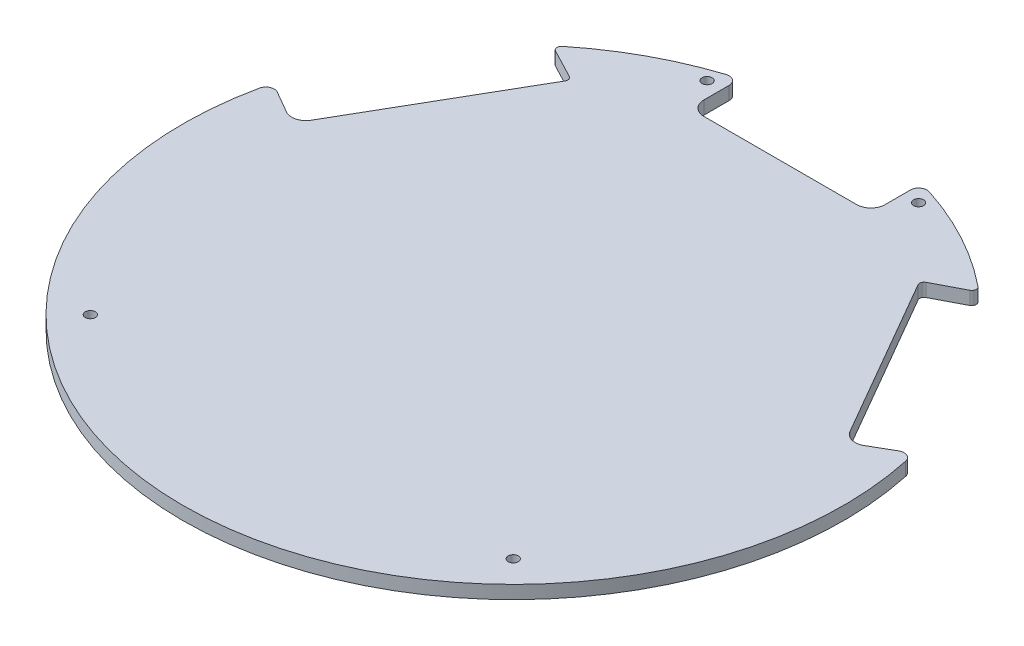
ISO-10303-21;
HEADER;
FILE_DESCRIPTION(('STEP AP214'),'2;1');
FILE_NAME('part.step','',(''),(''),'','','');
FILE_SCHEMA(('AUTOMOTIVE_DESIGN { 1 0 10303 214 1 1 1 1 }'));
ENDSEC;
DATA;
#1=APPLICATION_CONTEXT('core data for automotive mechanical design processes');
#2=APPLICATION_PROTOCOL_DEFINITION('international standard','automotive_design',2000,#1);
#3=PRODUCT_CONTEXT('',#1,'mechanical');
#4=PRODUCT('Part','Part','',(#3));
#5=PRODUCT_RELATED_PRODUCT_CATEGORY('part','',(#4));
#6=PRODUCT_DEFINITION_FORMATION('','',#4);
#7=PRODUCT_DEFINITION_CONTEXT('part definition',#1,'design');
#8=PRODUCT_DEFINITION('design','',#6,#7);
#9=PRODUCT_DEFINITION_SHAPE('','',#8);
#10=(LENGTH_UNIT() NAMED_UNIT(*) SI_UNIT(.MILLI.,.METRE.));
#11=(NAMED_UNIT(*) PLANE_ANGLE_UNIT() SI_UNIT($,.RADIAN.));
#12=(NAMED_UNIT(*) SI_UNIT($,.STERADIAN.) SOLID_ANGLE_UNIT());
#13=UNCERTAINTY_MEASURE_WITH_UNIT(LENGTH_MEASURE(1.E-05),#10,'distance_accuracy_value','');
#14=(GEOMETRIC_REPRESENTATION_CONTEXT(3) GLOBAL_UNCERTAINTY_ASSIGNED_CONTEXT((#13)) GLOBAL_UNIT_ASSIGNED_CONTEXT((#10,
#11,#12)) REPRESENTATION_CONTEXT('',''));
#15=CARTESIAN_POINT('',(0.,0.,0.));
#16=DIRECTION('',(0.,0.,1.));
#17=DIRECTION('',(1.,0.,0.));
#18=AXIS2_PLACEMENT_3D('',#15,#16,#17);
#19=CARTESIAN_POINT('',(-10.2861425547404,3.,17.8161215187071));
#20=DIRECTION('',(-0.499999999999991,0.,0.866025403784444));
#21=DIRECTION('',(0.866025403784444,0.,0.499999999999991));
#22=AXIS2_PLACEMENT_3D('',#19,#20,#21);
#23=PLANE('',#22);
#24=DIRECTION('',(-0.866025403784444,0.,-0.499999999999991));
#25=VECTOR('',#24,1.);
#26=CARTESIAN_POINT('',(-10.2861425547404,0.,17.8161215187071));
#27=LINE('',#26,#25);
#28=CARTESIAN_POINT('',(-65.5613562943293,0.,-14.0970380133579));
#29=VERTEX_POINT('',#28);
#30=CARTESIAN_POINT('',(-70.5381646243506,0.,-16.9703996424007));
#31=VERTEX_POINT('',#30);
#32=EDGE_CURVE('E241',#29,#31,#27,.T.);
#33=ORIENTED_EDGE('',*,*,#32,.T.);
#34=DIRECTION('',(0.,-1.,0.));
#35=VECTOR('',#34,1.);
#36=CARTESIAN_POINT('',(-70.5381646243506,3.,-16.9703996424007));
#37=LINE('',#36,#35);
#38=CARTESIAN_POINT('',(-70.5381646243506,3.,-16.9703996424007));
#39=VERTEX_POINT('',#38);
#40=EDGE_CURVE('E11',#39,#31,#37,.T.);
#41=ORIENTED_EDGE('',*,*,#40,.F.);
#42=DIRECTION('',(-0.866025403784444,0.,-0.499999999999991));
#43=VECTOR('',#42,1.);
#44=CARTESIAN_POINT('',(-10.2861425547404,3.,17.8161215187071));
#45=LINE('',#44,#43);
#46=CARTESIAN_POINT('',(-65.5613562943293,3.,-14.0970380133579));
#47=VERTEX_POINT('',#46);
#48=EDGE_CURVE('E371',#47,#39,#45,.T.);
#49=ORIENTED_EDGE('',*,*,#48,.F.);
#50=DIRECTION('',(0.,-1.,0.));
#51=VECTOR('',#50,1.);
#52=CARTESIAN_POINT('',(-65.5613562943293,3.,-14.0970380133579));
#53=LINE('',#52,#51);
#54=EDGE_CURVE('E52',#47,#29,#53,.T.);
#55=ORIENTED_EDGE('',*,*,#54,.T.);
#56=EDGE_LOOP('',(#33,#41,#49,#55));
#57=FACE_BOUND('',#56,.T.);
#58=ADVANCED_FACE('F35',(#57),#23,.F.);
#59=CARTESIAN_POINT('',(-71.4834513960105,3.,-15.3331149261629));
#60=DIRECTION('',(0.,-1.,0.));
#61=DIRECTION('',(0.,0.,-1.));
#62=AXIS2_PLACEMENT_3D('',#59,#60,#61);
#63=CYLINDRICAL_SURFACE('',#62,1.89057354331991);
#64=CARTESIAN_POINT('',(-71.4834513960105,0.,-15.3331149261629));
#65=DIRECTION('',(0.,1.,0.));
#66=DIRECTION('',(0.,0.,1.));
#67=AXIS2_PLACEMENT_3D('',#64,#65,#66);
#68=CIRCLE('',#67,1.89057354331991);
#69=CARTESIAN_POINT('',(-73.3319780299128,0.,-15.7296216807777));
#70=VERTEX_POINT('',#69);
#71=EDGE_CURVE('E243',#31,#70,#68,.T.);
#72=ORIENTED_EDGE('',*,*,#71,.T.);
#73=DIRECTION('',(0.,-1.,0.));
#74=VECTOR('',#73,1.);
#75=CARTESIAN_POINT('',(-73.3319780299128,3.,-15.7296216807777));
#76=LINE('',#75,#74);
#77=CARTESIAN_POINT('',(-73.3319780299128,3.,-15.7296216807777));
#78=VERTEX_POINT('',#77);
#79=EDGE_CURVE('E44',#78,#70,#76,.T.);
#80=ORIENTED_EDGE('',*,*,#79,.F.);
#81=CARTESIAN_POINT('',(-71.4834513960105,3.,-15.3331149261629));
#82=DIRECTION('',(0.,1.,0.));
#83=DIRECTION('',(0.,0.,1.));
#84=AXIS2_PLACEMENT_3D('',#81,#82,#83);
#85=CIRCLE('',#84,1.89057354331991);
#86=EDGE_CURVE('E138',#39,#78,#85,.T.);
#87=ORIENTED_EDGE('',*,*,#86,.F.);
#88=ORIENTED_EDGE('',*,*,#40,.T.);
#89=EDGE_LOOP('',(#72,#80,#87,#88));
#90=FACE_BOUND('',#89,.T.);
#91=ADVANCED_FACE('F354',(#90),#63,.T.);
#92=CARTESIAN_POINT('',(0.,3.,0.));
#93=DIRECTION('',(0.,-1.,0.));
#94=DIRECTION('',(0.,0.,-1.));
#95=AXIS2_PLACEMENT_3D('',#92,#93,#94);
#96=CYLINDRICAL_SURFACE('',#95,75.);
#97=CARTESIAN_POINT('',(0.,0.,0.));
#98=DIRECTION('',(0.,1.,0.));
#99=DIRECTION('',(0.,0.,1.));
#100=AXIS2_PLACEMENT_3D('',#97,#98,#99);
#101=CIRCLE('',#100,75.);
#102=CARTESIAN_POINT('',(73.3319780299128,0.,-15.7296216807778));
#103=VERTEX_POINT('',#102);
#104=EDGE_CURVE('E246',#103,#70,#101,.F.);
#105=ORIENTED_EDGE('',*,*,#104,.F.);
#106=DIRECTION('',(0.,-1.,0.));
#107=VECTOR('',#106,1.);
#108=CARTESIAN_POINT('',(73.3319780299128,3.,-15.7296216807778));
#109=LINE('',#108,#107);
#110=CARTESIAN_POINT('',(73.3319780299128,3.,-15.7296216807778));
#111=VERTEX_POINT('',#110);
#112=EDGE_CURVE('E347',#111,#103,#109,.T.);
#113=ORIENTED_EDGE('',*,*,#112,.F.);
#114=CARTESIAN_POINT('',(0.,3.,0.));
#115=DIRECTION('',(0.,1.,0.));
#116=DIRECTION('',(0.,0.,1.));
#117=AXIS2_PLACEMENT_3D('',#114,#115,#116);
#118=CIRCLE('',#117,75.);
#119=EDGE_CURVE('E353',#111,#78,#118,.F.);
#120=ORIENTED_EDGE('',*,*,#119,.T.);
#121=ORIENTED_EDGE('',*,*,#79,.T.);
#122=EDGE_LOOP('',(#105,#113,#120,#121));
#123=FACE_BOUND('',#122,.T.);
#124=ADVANCED_FACE('F351',(#123),#96,.T.);
#125=CARTESIAN_POINT('',(71.4834513960105,3.,-15.333114926163));
#126=DIRECTION('',(0.,-1.,0.));
#127=DIRECTION('',(0.,0.,-1.));
#128=AXIS2_PLACEMENT_3D('',#125,#126,#127);
#129=CYLINDRICAL_SURFACE('',#128,1.89057354331991);
#130=CARTESIAN_POINT('',(71.4834513960105,0.,-15.333114926163));
#131=DIRECTION('',(0.,1.,0.));
#132=DIRECTION('',(0.,0.,1.));
#133=AXIS2_PLACEMENT_3D('',#130,#131,#132);
#134=CIRCLE('',#133,1.89057354331991);
#135=CARTESIAN_POINT('',(70.5381646243506,0.,-16.9703996424008));
#136=VERTEX_POINT('',#135);
#137=EDGE_CURVE('E249',#136,#103,#134,.F.);
#138=ORIENTED_EDGE('',*,*,#137,.F.);
#139=DIRECTION('',(0.,-1.,0.));
#140=VECTOR('',#139,1.);
#141=CARTESIAN_POINT('',(70.5381646243506,3.,-16.9703996424008));
#142=LINE('',#141,#140);
#143=CARTESIAN_POINT('',(70.5381646243506,3.,-16.9703996424008));
#144=VERTEX_POINT('',#143);
#145=EDGE_CURVE('E345',#144,#136,#142,.T.);
#146=ORIENTED_EDGE('',*,*,#145,.F.);
#147=CARTESIAN_POINT('',(71.4834513960105,3.,-15.333114926163));
#148=DIRECTION('',(0.,1.,0.));
#149=DIRECTION('',(0.,0.,1.));
#150=AXIS2_PLACEMENT_3D('',#147,#148,#149);
#151=CIRCLE('',#150,1.89057354331991);
#152=EDGE_CURVE('E365',#144,#111,#151,.F.);
#153=ORIENTED_EDGE('',*,*,#152,.T.);
#154=ORIENTED_EDGE('',*,*,#112,.T.);
#155=EDGE_LOOP('',(#138,#146,#153,#154));
#156=FACE_BOUND('',#155,.T.);
#157=ADVANCED_FACE('F362',(#156),#129,.T.);
#158=CARTESIAN_POINT('',(10.2861425547403,3.,17.8161215187071));
#159=DIRECTION('',(-0.499999999999991,0.,-0.866025403784444));
#160=DIRECTION('',(-0.866025403784444,0.,0.499999999999991));
#161=AXIS2_PLACEMENT_3D('',#158,#159,#160);
#162=PLANE('',#161);
#163=DIRECTION('',(0.866025403784444,0.,-0.499999999999991));
#164=VECTOR('',#163,1.);
#165=CARTESIAN_POINT('',(10.2861425547403,0.,17.8161215187071));
#166=LINE('',#165,#164);
#167=CARTESIAN_POINT('',(65.5613562943293,0.,-14.0970380133579));
#168=VERTEX_POINT('',#167);
#169=EDGE_CURVE('E252',#168,#136,#166,.T.);
#170=ORIENTED_EDGE('',*,*,#169,.F.);
#171=DIRECTION('',(0.,-1.,0.));
#172=VECTOR('',#171,1.);
#173=CARTESIAN_POINT('',(65.5613562943293,3.,-14.0970380133579));
#174=LINE('',#173,#172);
#175=CARTESIAN_POINT('',(65.5613562943293,3.,-14.0970380133579));
#176=VERTEX_POINT('',#175);
#177=EDGE_CURVE('E343',#176,#168,#174,.T.);
#178=ORIENTED_EDGE('',*,*,#177,.F.);
#179=DIRECTION('',(0.866025403784444,0.,-0.499999999999991));
#180=VECTOR('',#179,1.);
#181=CARTESIAN_POINT('',(10.2861425547403,3.,17.8161215187071));
#182=LINE('',#181,#180);
#183=EDGE_CURVE('E369',#176,#144,#182,.T.);
#184=ORIENTED_EDGE('',*,*,#183,.T.);
#185=ORIENTED_EDGE('',*,*,#145,.T.);
#186=EDGE_LOOP('',(#170,#178,#184,#185));
#187=FACE_BOUND('',#186,.T.);
#188=ADVANCED_FACE('F673',(#187),#162,.T.);
#189=CARTESIAN_POINT('',(63.9517224423217,3.,-16.885005626618));
#190=DIRECTION('',(0.,-1.,0.));
#191=DIRECTION('',(0.,0.,-1.));
#192=AXIS2_PLACEMENT_3D('',#189,#190,#191);
#193=CYLINDRICAL_SURFACE('',#192,3.21926770401525);
#194=CARTESIAN_POINT('',(63.9517224423217,0.,-16.885005626618));
#195=DIRECTION('',(0.,1.,0.));
#196=DIRECTION('',(0.,0.,1.));
#197=AXIS2_PLACEMENT_3D('',#194,#195,#196);
#198=CIRCLE('',#197,3.21926770401525);
#199=CARTESIAN_POINT('',(61.1637548290617,0.,-15.2753717746103));
#200=VERTEX_POINT('',#199);
#201=EDGE_CURVE('E255',#168,#200,#198,.F.);
#202=ORIENTED_EDGE('',*,*,#201,.T.);
#203=DIRECTION('',(0.,-1.,0.));
#204=VECTOR('',#203,1.);
#205=CARTESIAN_POINT('',(61.1637548290617,3.,-15.2753717746103));
#206=LINE('',#205,#204);
#207=CARTESIAN_POINT('',(61.1637548290617,3.,-15.2753717746103));
#208=VERTEX_POINT('',#207);
#209=EDGE_CURVE('E340',#208,#200,#206,.T.);
#210=ORIENTED_EDGE('',*,*,#209,.F.);
#211=CARTESIAN_POINT('',(63.9517224423217,3.,-16.885005626618));
#212=DIRECTION('',(0.,1.,0.));
#213=DIRECTION('',(0.,0.,1.));
#214=AXIS2_PLACEMENT_3D('',#211,#212,#213);
#215=CIRCLE('',#214,3.21926770401525);
#216=EDGE_CURVE('E376',#176,#208,#215,.F.);
#217=ORIENTED_EDGE('',*,*,#216,.F.);
#218=ORIENTED_EDGE('',*,*,#177,.T.);
#219=EDGE_LOOP('',(#202,#210,#217,#218));
#220=FACE_BOUND('',#219,.T.);
#221=ADVANCED_FACE('F663',(#220),#193,.F.);
#222=CARTESIAN_POINT('',(52.4872461263284,3.,-30.3035256800579));
#223=DIRECTION('',(-0.866025403784438,0.,0.5));
#224=DIRECTION('',(0.500000000000001,0.,0.866025403784438));
#225=AXIS2_PLACEMENT_3D('',#222,#223,#224);
#226=PLANE('',#225);
#227=DIRECTION('',(-0.500000000000001,0.,-0.866025403784438));
#228=VECTOR('',#227,1.);
#229=CARTESIAN_POINT('',(52.4872461263284,0.,-30.3035256800579));
#230=LINE('',#229,#228);
#231=CARTESIAN_POINT('',(40.0698204779403,0.,-51.811137802275));
#232=VERTEX_POINT('',#231);
#233=EDGE_CURVE('E257',#200,#232,#230,.T.);
#234=ORIENTED_EDGE('',*,*,#233,.T.);
#235=DIRECTION('',(0.,-1.,0.));
#236=VECTOR('',#235,1.);
#237=CARTESIAN_POINT('',(40.0698204779403,3.,-51.811137802275));
#238=LINE('',#237,#236);
#239=CARTESIAN_POINT('',(40.0698204779403,3.,-51.811137802275));
#240=VERTEX_POINT('',#239);
#241=EDGE_CURVE('E338',#240,#232,#238,.T.);
#242=ORIENTED_EDGE('',*,*,#241,.F.);
#243=DIRECTION('',(-0.500000000000001,0.,-0.866025403784438));
#244=VECTOR('',#243,1.);
#245=CARTESIAN_POINT('',(52.4872461263284,3.,-30.3035256800579));
#246=LINE('',#245,#244);
#247=EDGE_CURVE('E378',#208,#240,#246,.T.);
#248=ORIENTED_EDGE('',*,*,#247,.F.);
#249=ORIENTED_EDGE('',*,*,#209,.T.);
#250=EDGE_LOOP('',(#234,#242,#248,#249));
#251=FACE_BOUND('',#250,.T.);
#252=ADVANCED_FACE('F653',(#251),#226,.F.);
#253=CARTESIAN_POINT('',(40.9358458817247,3.,-52.311137802275));
#254=DIRECTION('',(0.,-1.,0.));
#255=DIRECTION('',(0.,0.,-1.));
#256=AXIS2_PLACEMENT_3D('',#253,#254,#255);
#257=CYLINDRICAL_SURFACE('',#256,0.999999999999999);
#258=CARTESIAN_POINT('',(40.9358458817247,0.,-52.311137802275));
#259=DIRECTION('',(0.,1.,0.));
#260=DIRECTION('',(0.,0.,1.));
#261=AXIS2_PLACEMENT_3D('',#258,#259,#260);
#262=CIRCLE('',#261,0.999999999999999);
#263=CARTESIAN_POINT('',(40.4729422356537,0.,-53.1975464069569));
#264=VERTEX_POINT('',#263);
#265=EDGE_CURVE('E260',#264,#232,#262,.T.);
#266=ORIENTED_EDGE('',*,*,#265,.F.);
#267=DIRECTION('',(0.,-1.,0.));
#268=VECTOR('',#267,1.);
#269=CARTESIAN_POINT('',(40.4729422356537,3.,-53.1975464069569));
#270=LINE('',#269,#268);
#271=CARTESIAN_POINT('',(40.4729422356537,3.,-53.1975464069569));
#272=VERTEX_POINT('',#271);
#273=EDGE_CURVE('E336',#272,#264,#270,.T.);
#274=ORIENTED_EDGE('',*,*,#273,.F.);
#275=CARTESIAN_POINT('',(40.9358458817247,3.,-52.311137802275));
#276=DIRECTION('',(0.,1.,0.));
#277=DIRECTION('',(0.,0.,1.));
#278=AXIS2_PLACEMENT_3D('',#275,#276,#277);
#279=CIRCLE('',#278,0.999999999999999);
#280=EDGE_CURVE('E380',#272,#240,#279,.T.);
#281=ORIENTED_EDGE('',*,*,#280,.T.);
#282=ORIENTED_EDGE('',*,*,#241,.T.);
#283=EDGE_LOOP('',(#266,#274,#281,#282));
#284=FACE_BOUND('',#283,.T.);
#285=ADVANCED_FACE('F643',(#284),#257,.F.);
#286=CARTESIAN_POINT('',(-13.1555782855325,3.,-25.1914580730515));
#287=DIRECTION('',(-0.462903646071081,0.,-0.886408604681892));
#288=DIRECTION('',(-0.886408604681893,0.,0.462903646071081));
#289=AXIS2_PLACEMENT_3D('',#286,#287,#288);
#290=PLANE('',#289);
#291=DIRECTION('',(0.886408604681893,0.,-0.462903646071081));
#292=VECTOR('',#291,1.);
#293=CARTESIAN_POINT('',(-13.1555782855325,0.,-25.1914580730515));
#294=LINE('',#293,#292);
#295=CARTESIAN_POINT('',(47.0320347580914,0.,-56.6228604523272));
#296=VERTEX_POINT('',#295);
#297=EDGE_CURVE('E263',#264,#296,#294,.T.);
#298=ORIENTED_EDGE('',*,*,#297,.T.);
#299=DIRECTION('',(0.,-1.,0.));
#300=VECTOR('',#299,1.);
#301=CARTESIAN_POINT('',(47.0320347580914,3.,-56.6228604523272));
#302=LINE('',#301,#300);
#303=CARTESIAN_POINT('',(47.0320347580914,3.,-56.6228604523272));
#304=VERTEX_POINT('',#303);
#305=EDGE_CURVE('E333',#304,#296,#302,.T.);
#306=ORIENTED_EDGE('',*,*,#305,.F.);
#307=DIRECTION('',(0.886408604681893,0.,-0.462903646071081));
#308=VECTOR('',#307,1.);
#309=CARTESIAN_POINT('',(-13.1555782855325,3.,-25.1914580730515));
#310=LINE('',#309,#308);
#311=EDGE_CURVE('E383',#272,#304,#310,.T.);
#312=ORIENTED_EDGE('',*,*,#311,.F.);
#313=ORIENTED_EDGE('',*,*,#273,.T.);
#314=EDGE_LOOP('',(#298,#306,#312,#313));
#315=FACE_BOUND('',#314,.T.);
#316=ADVANCED_FACE('F632',(#315),#290,.F.);
#317=CARTESIAN_POINT('',(46.5691311120203,3.,-57.5092690570091));
#318=DIRECTION('',(0.,-1.,0.));
#319=DIRECTION('',(0.,0.,-1.));
#320=AXIS2_PLACEMENT_3D('',#317,#318,#319);
#321=CYLINDRICAL_SURFACE('',#320,0.999999999999999);
#322=CARTESIAN_POINT('',(46.5691311120203,0.,-57.5092690570091));
#323=DIRECTION('',(0.,1.,0.));
#324=DIRECTION('',(0.,0.,1.));
#325=AXIS2_PLACEMENT_3D('',#322,#323,#324);
#326=CIRCLE('',#325,0.999999999999999);
#327=CARTESIAN_POINT('',(47.1984436946152,0.,-58.2864213415632));
#328=VERTEX_POINT('',#327);
#329=EDGE_CURVE('E265',#296,#328,#326,.T.);
#330=ORIENTED_EDGE('',*,*,#329,.T.);
#331=DIRECTION('',(0.,-1.,0.));
#332=VECTOR('',#331,1.);
#333=CARTESIAN_POINT('',(47.1984436946152,3.,-58.2864213415632));
#334=LINE('',#333,#332);
#335=CARTESIAN_POINT('',(47.1984436946152,3.,-58.2864213415632));
#336=VERTEX_POINT('',#335);
#337=EDGE_CURVE('E330',#336,#328,#334,.T.);
#338=ORIENTED_EDGE('',*,*,#337,.F.);
#339=CARTESIAN_POINT('',(46.5691311120203,3.,-57.5092690570091));
#340=DIRECTION('',(0.,1.,0.));
#341=DIRECTION('',(0.,0.,1.));
#342=AXIS2_PLACEMENT_3D('',#339,#340,#341);
#343=CIRCLE('',#342,0.999999999999999);
#344=EDGE_CURVE('E385',#304,#336,#343,.T.);
#345=ORIENTED_EDGE('',*,*,#344,.F.);
#346=ORIENTED_EDGE('',*,*,#305,.T.);
#347=EDGE_LOOP('',(#330,#338,#345,#346));
#348=FACE_BOUND('',#347,.T.);
#349=ADVANCED_FACE('F621',(#348),#321,.T.);
#350=CARTESIAN_POINT('',(0.,3.,0.));
#351=DIRECTION('',(0.,-1.,0.));
#352=DIRECTION('',(0.,0.,-1.));
#353=AXIS2_PLACEMENT_3D('',#350,#351,#352);
#354=CYLINDRICAL_SURFACE('',#353,75.);
#355=CARTESIAN_POINT('',(0.,0.,0.));
#356=DIRECTION('',(0.,1.,0.));
#357=DIRECTION('',(0.,0.,1.));
#358=AXIS2_PLACEMENT_3D('',#355,#356,#357);
#359=CIRCLE('',#358,75.);
#360=CARTESIAN_POINT('',(23.0437370474843,0.,-71.3721667240556));
#361=VERTEX_POINT('',#360);
#362=EDGE_CURVE('E267',#328,#361,#359,.T.);
#363=ORIENTED_EDGE('',*,*,#362,.T.);
#364=DIRECTION('',(0.,-1.,0.));
#365=VECTOR('',#364,1.);
#366=CARTESIAN_POINT('',(23.0437370474843,3.,-71.3721667240556));
#367=LINE('',#366,#365);
#368=CARTESIAN_POINT('',(23.0437370474843,3.,-71.3721667240556));
#369=VERTEX_POINT('',#368);
#370=EDGE_CURVE('E328',#369,#361,#367,.T.);
#371=ORIENTED_EDGE('',*,*,#370,.F.);
#372=CARTESIAN_POINT('',(0.,3.,0.));
#373=DIRECTION('',(0.,1.,0.));
#374=DIRECTION('',(0.,0.,1.));
#375=AXIS2_PLACEMENT_3D('',#372,#373,#374);
#376=CIRCLE('',#375,75.);
#377=EDGE_CURVE('E387',#336,#369,#376,.T.);
#378=ORIENTED_EDGE('',*,*,#377,.F.);
#379=ORIENTED_EDGE('',*,*,#337,.T.);
#380=EDGE_LOOP('',(#363,#371,#378,#379));
#381=FACE_BOUND('',#380,.T.);
#382=ADVANCED_FACE('F611',(#381),#354,.T.);
#383=CARTESIAN_POINT('',(22.4628586528018,3.,-69.5730423222168));
#384=DIRECTION('',(0.,-1.,0.));
#385=DIRECTION('',(0.,0.,-1.));
#386=AXIS2_PLACEMENT_3D('',#383,#384,#385);
#387=CYLINDRICAL_SURFACE('',#386,1.89057354331991);
#388=CARTESIAN_POINT('',(22.4628586528018,0.,-69.5730423222168));
#389=DIRECTION('',(0.,1.,0.));
#390=DIRECTION('',(0.,0.,1.));
#391=AXIS2_PLACEMENT_3D('',#388,#389,#390);
#392=CIRCLE('',#391,1.89057354331991);
#393=CARTESIAN_POINT('',(20.5722851094818,0.,-69.5730423222168));
#394=VERTEX_POINT('',#393);
#395=EDGE_CURVE('E270',#394,#361,#392,.F.);
#396=ORIENTED_EDGE('',*,*,#395,.F.);
#397=DIRECTION('',(0.,-1.,0.));
#398=VECTOR('',#397,1.);
#399=CARTESIAN_POINT('',(20.5722851094818,3.,-69.5730423222168));
#400=LINE('',#399,#398);
#401=CARTESIAN_POINT('',(20.5722851094818,3.,-69.5730423222168));
#402=VERTEX_POINT('',#401);
#403=EDGE_CURVE('E326',#402,#394,#400,.T.);
#404=ORIENTED_EDGE('',*,*,#403,.F.);
#405=CARTESIAN_POINT('',(22.4628586528018,3.,-69.5730423222168));
#406=DIRECTION('',(0.,1.,0.));
#407=DIRECTION('',(0.,0.,1.));
#408=AXIS2_PLACEMENT_3D('',#405,#406,#407);
#409=CIRCLE('',#408,1.89057354331991);
#410=EDGE_CURVE('E389',#402,#369,#409,.F.);
#411=ORIENTED_EDGE('',*,*,#410,.T.);
#412=ORIENTED_EDGE('',*,*,#370,.T.);
#413=EDGE_LOOP('',(#396,#404,#411,#412));
#414=FACE_BOUND('',#413,.T.);
#415=ADVANCED_FACE('F601',(#414),#387,.T.);
#416=CARTESIAN_POINT('',(20.5722851094811,3.,2.11140440779974E-13));
#417=DIRECTION('',(-1.,0.,0.));
#418=DIRECTION('',(0.,0.,1.));
#419=AXIS2_PLACEMENT_3D('',#416,#417,#418);
#420=PLANE('',#419);
#421=DIRECTION('',(0.,0.,-1.));
#422=VECTOR('',#421,1.);
#423=CARTESIAN_POINT('',(20.5722851094811,0.,2.11140440779974E-13));
#424=LINE('',#423,#422);
#425=CARTESIAN_POINT('',(20.5722851094818,0.,-63.826319064131));
#426=VERTEX_POINT('',#425);
#427=EDGE_CURVE('E273',#426,#394,#424,.T.);
#428=ORIENTED_EDGE('',*,*,#427,.F.);
#429=DIRECTION('',(0.,-1.,0.));
#430=VECTOR('',#429,1.);
#431=CARTESIAN_POINT('',(20.5722851094818,3.,-63.826319064131));
#432=LINE('',#431,#430);
#433=CARTESIAN_POINT('',(20.5722851094818,3.,-63.826319064131));
#434=VERTEX_POINT('',#433);
#435=EDGE_CURVE('E324',#434,#426,#432,.T.);
#436=ORIENTED_EDGE('',*,*,#435,.F.);
#437=DIRECTION('',(0.,0.,-1.));
#438=VECTOR('',#437,1.);
#439=CARTESIAN_POINT('',(20.5722851094811,3.,2.11140440779974E-13));
#440=LINE('',#439,#438);
#441=EDGE_CURVE('E392',#434,#402,#440,.T.);
#442=ORIENTED_EDGE('',*,*,#441,.T.);
#443=ORIENTED_EDGE('',*,*,#403,.T.);
#444=EDGE_LOOP('',(#428,#436,#442,#443));
#445=FACE_BOUND('',#444,.T.);
#446=ADVANCED_FACE('F591',(#445),#420,.T.);
#447=CARTESIAN_POINT('',(17.3530174054665,3.,-63.826319064131));
#448=DIRECTION('',(0.,-1.,0.));
#449=DIRECTION('',(0.,0.,-1.));
#450=AXIS2_PLACEMENT_3D('',#447,#448,#449);
#451=CYLINDRICAL_SURFACE('',#450,3.21926770401525);
#452=CARTESIAN_POINT('',(17.3530174054665,0.,-63.826319064131));
#453=DIRECTION('',(0.,1.,0.));
#454=DIRECTION('',(0.,0.,1.));
#455=AXIS2_PLACEMENT_3D('',#452,#453,#454);
#456=CIRCLE('',#455,3.21926770401525);
#457=CARTESIAN_POINT('',(17.3530174054665,0.,-60.6070513601157));
#458=VERTEX_POINT('',#457);
#459=EDGE_CURVE('E276',#426,#458,#456,.F.);
#460=ORIENTED_EDGE('',*,*,#459,.T.);
#461=DIRECTION('',(0.,-1.,0.));
#462=VECTOR('',#461,1.);
#463=CARTESIAN_POINT('',(17.3530174054665,3.,-60.6070513601157));
#464=LINE('',#463,#462);
#465=CARTESIAN_POINT('',(17.3530174054665,3.,-60.6070513601157));
#466=VERTEX_POINT('',#465);
#467=EDGE_CURVE('E322',#466,#458,#464,.T.);
#468=ORIENTED_EDGE('',*,*,#467,.F.);
#469=CARTESIAN_POINT('',(17.3530174054665,3.,-63.826319064131));
#470=DIRECTION('',(0.,1.,0.));
#471=DIRECTION('',(0.,0.,1.));
#472=AXIS2_PLACEMENT_3D('',#469,#470,#471);
#473=CIRCLE('',#472,3.21926770401525);
#474=EDGE_CURVE('E395',#434,#466,#473,.F.);
#475=ORIENTED_EDGE('',*,*,#474,.F.);
#476=ORIENTED_EDGE('',*,*,#435,.T.);
#477=EDGE_LOOP('',(#460,#468,#475,#476));
#478=FACE_BOUND('',#477,.T.);
#479=ADVANCED_FACE('F580',(#478),#451,.F.);
#480=CARTESIAN_POINT('',(0.,3.,-60.6070513601157));
#481=DIRECTION('',(0.,0.,-1.));
#482=DIRECTION('',(-1.,0.,0.));
#483=AXIS2_PLACEMENT_3D('',#480,#481,#482);
#484=PLANE('',#483);
#485=DIRECTION('',(1.,0.,0.));
#486=VECTOR('',#485,1.);
#487=CARTESIAN_POINT('',(0.,0.,-60.6070513601157));
#488=LINE('',#487,#486);
#489=CARTESIAN_POINT('',(-17.3530174054665,0.,-60.6070513601157));
#490=VERTEX_POINT('',#489);
#491=EDGE_CURVE('E279',#490,#458,#488,.T.);
#492=ORIENTED_EDGE('',*,*,#491,.F.);
#493=DIRECTION('',(0.,-1.,0.));
#494=VECTOR('',#493,1.);
#495=CARTESIAN_POINT('',(-17.3530174054665,3.,-60.6070513601157));
#496=LINE('',#495,#494);
#497=CARTESIAN_POINT('',(-17.3530174054665,3.,-60.6070513601157));
#498=VERTEX_POINT('',#497);
#499=EDGE_CURVE('E320',#498,#490,#496,.T.);
#500=ORIENTED_EDGE('',*,*,#499,.F.);
#501=DIRECTION('',(1.,0.,0.));
#502=VECTOR('',#501,1.);
#503=CARTESIAN_POINT('',(0.,3.,-60.6070513601157));
#504=LINE('',#503,#502);
#505=EDGE_CURVE('E397',#498,#466,#504,.T.);
#506=ORIENTED_EDGE('',*,*,#505,.T.);
#507=ORIENTED_EDGE('',*,*,#467,.T.);
#508=EDGE_LOOP('',(#492,#500,#506,#507));
#509=FACE_BOUND('',#508,.T.);
#510=ADVANCED_FACE('F570',(#509),#484,.T.);
#511=CARTESIAN_POINT('',(-17.3530174054665,3.,-63.826319064131));
#512=DIRECTION('',(0.,-1.,0.));
#513=DIRECTION('',(0.,0.,-1.));
#514=AXIS2_PLACEMENT_3D('',#511,#512,#513);
#515=CYLINDRICAL_SURFACE('',#514,3.21926770401525);
#516=CARTESIAN_POINT('',(-17.3530174054665,0.,-63.826319064131));
#517=DIRECTION('',(0.,1.,0.));
#518=DIRECTION('',(0.,0.,1.));
#519=AXIS2_PLACEMENT_3D('',#516,#517,#518);
#520=CIRCLE('',#519,3.21926770401525);
#521=CARTESIAN_POINT('',(-20.5722851094818,0.,-63.826319064131));
#522=VERTEX_POINT('',#521);
#523=EDGE_CURVE('E282',#522,#490,#520,.T.);
#524=ORIENTED_EDGE('',*,*,#523,.F.);
#525=DIRECTION('',(0.,-1.,0.));
#526=VECTOR('',#525,1.);
#527=CARTESIAN_POINT('',(-20.5722851094818,3.,-63.826319064131));
#528=LINE('',#527,#526);
#529=CARTESIAN_POINT('',(-20.5722851094818,3.,-63.826319064131));
#530=VERTEX_POINT('',#529);
#531=EDGE_CURVE('E318',#530,#522,#528,.T.);
#532=ORIENTED_EDGE('',*,*,#531,.F.);
#533=CARTESIAN_POINT('',(-17.3530174054665,3.,-63.826319064131));
#534=DIRECTION('',(0.,1.,0.));
#535=DIRECTION('',(0.,0.,1.));
#536=AXIS2_PLACEMENT_3D('',#533,#534,#535);
#537=CIRCLE('',#536,3.21926770401525);
#538=EDGE_CURVE('E400',#530,#498,#537,.T.);
#539=ORIENTED_EDGE('',*,*,#538,.T.);
#540=ORIENTED_EDGE('',*,*,#499,.T.);
#541=EDGE_LOOP('',(#524,#532,#539,#540));
#542=FACE_BOUND('',#541,.T.);
#543=ADVANCED_FACE('F560',(#542),#515,.F.);
#544=CARTESIAN_POINT('',(-20.5722851094811,3.,2.11140440779974E-13));
#545=DIRECTION('',(-1.,0.,0.));
#546=DIRECTION('',(0.,0.,1.));
#547=AXIS2_PLACEMENT_3D('',#544,#545,#546);
#548=PLANE('',#547);
#549=DIRECTION('',(0.,0.,-1.));
#550=VECTOR('',#549,1.);
#551=CARTESIAN_POINT('',(-20.5722851094811,0.,2.11140440779974E-13));
#552=LINE('',#551,#550);
#553=CARTESIAN_POINT('',(-20.5722851094818,0.,-69.5730423222168));
#554=VERTEX_POINT('',#553);
#555=EDGE_CURVE('E285',#522,#554,#552,.T.);
#556=ORIENTED_EDGE('',*,*,#555,.T.);
#557=DIRECTION('',(0.,-1.,0.));
#558=VECTOR('',#557,1.);
#559=CARTESIAN_POINT('',(-20.5722851094818,3.,-69.5730423222168));
#560=LINE('',#559,#558);
#561=CARTESIAN_POINT('',(-20.5722851094818,3.,-69.5730423222168));
#562=VERTEX_POINT('',#561);
#563=EDGE_CURVE('E315',#562,#554,#560,.T.);
#564=ORIENTED_EDGE('',*,*,#563,.F.);
#565=DIRECTION('',(0.,0.,-1.));
#566=VECTOR('',#565,1.);
#567=CARTESIAN_POINT('',(-20.5722851094811,3.,2.11140440779974E-13));
#568=LINE('',#567,#566);
#569=EDGE_CURVE('E403',#530,#562,#568,.T.);
#570=ORIENTED_EDGE('',*,*,#569,.F.);
#571=ORIENTED_EDGE('',*,*,#531,.T.);
#572=EDGE_LOOP('',(#556,#564,#570,#571));
#573=FACE_BOUND('',#572,.T.);
#574=ADVANCED_FACE('F549',(#573),#548,.F.);
#575=CARTESIAN_POINT('',(-22.4628586528018,3.,-69.5730423222168));
#576=DIRECTION('',(0.,-1.,0.));
#577=DIRECTION('',(0.,0.,-1.));
#578=AXIS2_PLACEMENT_3D('',#575,#576,#577);
#579=CYLINDRICAL_SURFACE('',#578,1.89057354331991);
#580=CARTESIAN_POINT('',(-22.4628586528018,0.,-69.5730423222168));
#581=DIRECTION('',(0.,1.,0.));
#582=DIRECTION('',(0.,0.,1.));
#583=AXIS2_PLACEMENT_3D('',#580,#581,#582);
#584=CIRCLE('',#583,1.89057354331991);
#585=CARTESIAN_POINT('',(-23.0437370474843,0.,-71.3721667240556));
#586=VERTEX_POINT('',#585);
#587=EDGE_CURVE('E287',#554,#586,#584,.T.);
#588=ORIENTED_EDGE('',*,*,#587,.T.);
#589=DIRECTION('',(0.,-1.,0.));
#590=VECTOR('',#589,1.);
#591=CARTESIAN_POINT('',(-23.0437370474843,3.,-71.3721667240556));
#592=LINE('',#591,#590);
#593=CARTESIAN_POINT('',(-23.0437370474843,3.,-71.3721667240556));
#594=VERTEX_POINT('',#593);
#595=EDGE_CURVE('E312',#594,#586,#592,.T.);
#596=ORIENTED_EDGE('',*,*,#595,.F.);
#597=CARTESIAN_POINT('',(-22.4628586528018,3.,-69.5730423222168));
#598=DIRECTION('',(0.,1.,0.));
#599=DIRECTION('',(0.,0.,1.));
#600=AXIS2_PLACEMENT_3D('',#597,#598,#599);
#601=CIRCLE('',#600,1.89057354331991);
#602=EDGE_CURVE('E405',#562,#594,#601,.T.);
#603=ORIENTED_EDGE('',*,*,#602,.F.);
#604=ORIENTED_EDGE('',*,*,#563,.T.);
#605=EDGE_LOOP('',(#588,#596,#603,#604));
#606=FACE_BOUND('',#605,.T.);
#607=ADVANCED_FACE('F538',(#606),#579,.T.);
#608=CARTESIAN_POINT('',(0.,3.,0.));
#609=DIRECTION('',(0.,-1.,0.));
#610=DIRECTION('',(0.,0.,-1.));
#611=AXIS2_PLACEMENT_3D('',#608,#609,#610);
#612=CYLINDRICAL_SURFACE('',#611,75.);
#613=CARTESIAN_POINT('',(0.,0.,0.));
#614=DIRECTION('',(0.,1.,0.));
#615=DIRECTION('',(0.,0.,1.));
#616=AXIS2_PLACEMENT_3D('',#613,#614,#615);
#617=CIRCLE('',#616,75.);
#618=CARTESIAN_POINT('',(-47.1984436946152,0.,-58.2864213415632));
#619=VERTEX_POINT('',#618);
#620=EDGE_CURVE('E289',#586,#619,#617,.T.);
#621=ORIENTED_EDGE('',*,*,#620,.T.);
#622=DIRECTION('',(0.,-1.,0.));
#623=VECTOR('',#622,1.);
#624=CARTESIAN_POINT('',(-47.1984436946152,3.,-58.2864213415632));
#625=LINE('',#624,#623);
#626=CARTESIAN_POINT('',(-47.1984436946152,3.,-58.2864213415632));
#627=VERTEX_POINT('',#626);
#628=EDGE_CURVE('E310',#627,#619,#625,.T.);
#629=ORIENTED_EDGE('',*,*,#628,.F.);
#630=CARTESIAN_POINT('',(0.,3.,0.));
#631=DIRECTION('',(0.,1.,0.));
#632=DIRECTION('',(0.,0.,1.));
#633=AXIS2_PLACEMENT_3D('',#630,#631,#632);
#634=CIRCLE('',#633,75.);
#635=EDGE_CURVE('E407',#594,#627,#634,.T.);
#636=ORIENTED_EDGE('',*,*,#635,.F.);
#637=ORIENTED_EDGE('',*,*,#595,.T.);
#638=EDGE_LOOP('',(#621,#629,#636,#637));
#639=FACE_BOUND('',#638,.T.);
#640=ADVANCED_FACE('F528',(#639),#612,.T.);
#641=CARTESIAN_POINT('',(-46.5691311120203,3.,-57.5092690570091));
#642=DIRECTION('',(0.,-1.,0.));
#643=DIRECTION('',(0.,0.,-1.));
#644=AXIS2_PLACEMENT_3D('',#641,#642,#643);
#645=CYLINDRICAL_SURFACE('',#644,0.999999999999999);
#646=CARTESIAN_POINT('',(-46.5691311120203,0.,-57.5092690570091));
#647=DIRECTION('',(0.,1.,0.));
#648=DIRECTION('',(0.,0.,1.));
#649=AXIS2_PLACEMENT_3D('',#646,#647,#648);
#650=CIRCLE('',#649,0.999999999999999);
#651=CARTESIAN_POINT('',(-47.0320347580914,0.,-56.6228604523272));
#652=VERTEX_POINT('',#651);
#653=EDGE_CURVE('E292',#652,#619,#650,.F.);
#654=ORIENTED_EDGE('',*,*,#653,.F.);
#655=DIRECTION('',(0.,-1.,0.));
#656=VECTOR('',#655,1.);
#657=CARTESIAN_POINT('',(-47.0320347580914,3.,-56.6228604523272));
#658=LINE('',#657,#656);
#659=CARTESIAN_POINT('',(-47.0320347580914,3.,-56.6228604523272));
#660=VERTEX_POINT('',#659);
#661=EDGE_CURVE('E308',#660,#652,#658,.T.);
#662=ORIENTED_EDGE('',*,*,#661,.F.);
#663=CARTESIAN_POINT('',(-46.5691311120203,3.,-57.5092690570091));
#664=DIRECTION('',(0.,1.,0.));
#665=DIRECTION('',(0.,0.,1.));
#666=AXIS2_PLACEMENT_3D('',#663,#664,#665);
#667=CIRCLE('',#666,0.999999999999999);
#668=EDGE_CURVE('E409',#660,#627,#667,.F.);
#669=ORIENTED_EDGE('',*,*,#668,.T.);
#670=ORIENTED_EDGE('',*,*,#628,.T.);
#671=EDGE_LOOP('',(#654,#662,#669,#670));
#672=FACE_BOUND('',#671,.T.);
#673=ADVANCED_FACE('F519',(#672),#645,.T.);
#674=CARTESIAN_POINT('',(13.1555782855325,3.,-25.1914580730515));
#675=DIRECTION('',(-0.462903646071081,0.,0.886408604681892));
#676=DIRECTION('',(0.886408604681893,0.,0.462903646071081));
#677=AXIS2_PLACEMENT_3D('',#674,#675,#676);
#678=PLANE('',#677);
#679=DIRECTION('',(-0.886408604681893,0.,-0.462903646071081));
#680=VECTOR('',#679,1.);
#681=CARTESIAN_POINT('',(13.1555782855325,0.,-25.1914580730515));
#682=LINE('',#681,#680);
#683=CARTESIAN_POINT('',(-40.4729422356537,0.,-53.1975464069569));
#684=VERTEX_POINT('',#683);
#685=EDGE_CURVE('E295',#684,#652,#682,.T.);
#686=ORIENTED_EDGE('',*,*,#685,.F.);
#687=DIRECTION('',(0.,-1.,0.));
#688=VECTOR('',#687,1.);
#689=CARTESIAN_POINT('',(-40.4729422356537,3.,-53.1975464069569));
#690=LINE('',#689,#688);
#691=CARTESIAN_POINT('',(-40.4729422356537,3.,-53.1975464069569));
#692=VERTEX_POINT('',#691);
#693=EDGE_CURVE('E221',#692,#684,#690,.T.);
#694=ORIENTED_EDGE('',*,*,#693,.F.);
#695=DIRECTION('',(-0.886408604681893,0.,-0.462903646071081));
#696=VECTOR('',#695,1.);
#697=CARTESIAN_POINT('',(13.1555782855325,3.,-25.1914580730515));
#698=LINE('',#697,#696);
#699=EDGE_CURVE('E211',#692,#660,#698,.T.);
#700=ORIENTED_EDGE('',*,*,#699,.T.);
#701=ORIENTED_EDGE('',*,*,#661,.T.);
#702=EDGE_LOOP('',(#686,#694,#700,#701));
#703=FACE_BOUND('',#702,.T.);
#704=ADVANCED_FACE('F413',(#703),#678,.T.);
#705=CARTESIAN_POINT('',(-40.9358458817247,3.,-52.311137802275));
#706=DIRECTION('',(0.,-1.,0.));
#707=DIRECTION('',(0.,0.,-1.));
#708=AXIS2_PLACEMENT_3D('',#705,#706,#707);
#709=CYLINDRICAL_SURFACE('',#708,0.999999999999999);
#710=CARTESIAN_POINT('',(-40.9358458817247,0.,-52.311137802275));
#711=DIRECTION('',(0.,1.,0.));
#712=DIRECTION('',(0.,0.,1.));
#713=AXIS2_PLACEMENT_3D('',#710,#711,#712);
#714=CIRCLE('',#713,0.999999999999999);
#715=CARTESIAN_POINT('',(-40.0698204779403,0.,-51.811137802275));
#716=VERTEX_POINT('',#715);
#717=EDGE_CURVE('E218',#684,#716,#714,.F.);
#718=ORIENTED_EDGE('',*,*,#717,.T.);
#719=DIRECTION('',(0.,-1.,0.));
#720=VECTOR('',#719,1.);
#721=CARTESIAN_POINT('',(-40.0698204779403,3.,-51.811137802275));
#722=LINE('',#721,#720);
#723=CARTESIAN_POINT('',(-40.0698204779403,3.,-51.811137802275));
#724=VERTEX_POINT('',#723);
#725=EDGE_CURVE('E215',#724,#716,#722,.T.);
#726=ORIENTED_EDGE('',*,*,#725,.F.);
#727=CARTESIAN_POINT('',(-40.9358458817247,3.,-52.311137802275));
#728=DIRECTION('',(0.,1.,0.));
#729=DIRECTION('',(0.,0.,1.));
#730=AXIS2_PLACEMENT_3D('',#727,#728,#729);
#731=CIRCLE('',#730,0.999999999999999);
#732=EDGE_CURVE('E203',#692,#724,#731,.F.);
#733=ORIENTED_EDGE('',*,*,#732,.F.);
#734=ORIENTED_EDGE('',*,*,#693,.T.);
#735=EDGE_LOOP('',(#718,#726,#733,#734));
#736=FACE_BOUND('',#735,.T.);
#737=ADVANCED_FACE('F216',(#736),#709,.F.);
#738=CARTESIAN_POINT('',(-52.4872461263284,3.,-30.3035256800579));
#739=DIRECTION('',(-0.866025403784438,0.,-0.5));
#740=DIRECTION('',(-0.5,0.,0.866025403784439));
#741=AXIS2_PLACEMENT_3D('',#738,#739,#740);
#742=PLANE('',#741);
#743=DIRECTION('',(0.5,0.,-0.866025403784439));
#744=VECTOR('',#743,1.);
#745=CARTESIAN_POINT('',(-52.4872461263284,0.,-30.3035256800579));
#746=LINE('',#745,#744);
#747=CARTESIAN_POINT('',(-61.1637548290617,0.,-15.2753717746103));
#748=VERTEX_POINT('',#747);
#749=EDGE_CURVE('E299',#748,#716,#746,.T.);
#750=ORIENTED_EDGE('',*,*,#749,.F.);
#751=DIRECTION('',(0.,-1.,0.));
#752=VECTOR('',#751,1.);
#753=CARTESIAN_POINT('',(-61.1637548290617,3.,-15.2753717746103));
#754=LINE('',#753,#752);
#755=CARTESIAN_POINT('',(-61.1637548290617,3.,-15.2753717746103));
#756=VERTEX_POINT('',#755);
#757=EDGE_CURVE('E126',#756,#748,#754,.T.);
#758=ORIENTED_EDGE('',*,*,#757,.F.);
#759=DIRECTION('',(0.5,0.,-0.866025403784439));
#760=VECTOR('',#759,1.);
#761=CARTESIAN_POINT('',(-52.4872461263284,3.,-30.3035256800579));
#762=LINE('',#761,#760);
#763=EDGE_CURVE('E208',#756,#724,#762,.T.);
#764=ORIENTED_EDGE('',*,*,#763,.T.);
#765=ORIENTED_EDGE('',*,*,#725,.T.);
#766=EDGE_LOOP('',(#750,#758,#764,#765));
#767=FACE_BOUND('',#766,.T.);
#768=ADVANCED_FACE('F223',(#767),#742,.T.);
#769=CARTESIAN_POINT('',(24.,3.,-68.));
#770=DIRECTION('',(0.,-1.,0.));
#771=DIRECTION('',(0.,0.,-1.));
#772=AXIS2_PLACEMENT_3D('',#769,#770,#771);
#773=CYLINDRICAL_SURFACE('',#772,1.15);
#774=CARTESIAN_POINT('',(24.,3.,-68.));
#775=DIRECTION('',(0.,1.,0.));
#776=DIRECTION('',(0.,0.,1.));
#777=AXIS2_PLACEMENT_3D('',#774,#775,#776);
#778=CIRCLE('',#777,1.15);
#779=CARTESIAN_POINT('',(24.,3.,-66.85));
#780=VERTEX_POINT('',#779);
#781=EDGE_CURVE('E797',#780,#780,#778,.F.);
#782=ORIENTED_EDGE('',*,*,#781,.F.);
#783=EDGE_LOOP('',(#782));
#784=FACE_BOUND('',#783,.T.);
#785=CARTESIAN_POINT('',(24.,0.,-68.));
#786=DIRECTION('',(0.,1.,0.));
#787=DIRECTION('',(0.,0.,1.));
#788=AXIS2_PLACEMENT_3D('',#785,#786,#787);
#789=CIRCLE('',#788,1.15);
#790=CARTESIAN_POINT('',(24.,0.,-66.85));
#791=VERTEX_POINT('',#790);
#792=EDGE_CURVE('E238',#791,#791,#789,.F.);
#793=ORIENTED_EDGE('',*,*,#792,.T.);
#794=EDGE_LOOP('',(#793));
#795=FACE_BOUND('',#794,.T.);
#796=ADVANCED_FACE('F436',(#784,#795),#773,.F.);
#797=CARTESIAN_POINT('',(-24.,3.,-68.));
#798=DIRECTION('',(0.,-1.,0.));
#799=DIRECTION('',(0.,0.,-1.));
#800=AXIS2_PLACEMENT_3D('',#797,#798,#799);
#801=CYLINDRICAL_SURFACE('',#800,1.15);
#802=CARTESIAN_POINT('',(-24.,3.,-68.));
#803=DIRECTION('',(0.,1.,0.));
#804=DIRECTION('',(0.,0.,1.));
#805=AXIS2_PLACEMENT_3D('',#802,#803,#804);
#806=CIRCLE('',#805,1.15);
#807=CARTESIAN_POINT('',(-24.,3.,-66.85));
#808=VERTEX_POINT('',#807);
#809=EDGE_CURVE('E794',#808,#808,#806,.T.);
#810=ORIENTED_EDGE('',*,*,#809,.T.);
#811=EDGE_LOOP('',(#810));
#812=FACE_BOUND('',#811,.T.);
#813=CARTESIAN_POINT('',(-24.,0.,-68.));
#814=DIRECTION('',(0.,1.,0.));
#815=DIRECTION('',(0.,0.,1.));
#816=AXIS2_PLACEMENT_3D('',#813,#814,#815);
#817=CIRCLE('',#816,1.15);
#818=CARTESIAN_POINT('',(-24.,0.,-66.85));
#819=VERTEX_POINT('',#818);
#820=EDGE_CURVE('E235',#819,#819,#817,.T.);
#821=ORIENTED_EDGE('',*,*,#820,.F.);
#822=EDGE_LOOP('',(#821));
#823=FACE_BOUND('',#822,.T.);
#824=ADVANCED_FACE('F439',(#812,#823),#801,.F.);
#825=CARTESIAN_POINT('',(-48.,3.,48.));
#826=DIRECTION('',(0.,-1.,0.));
#827=DIRECTION('',(0.,0.,-1.));
#828=AXIS2_PLACEMENT_3D('',#825,#826,#827);
#829=CYLINDRICAL_SURFACE('',#828,1.15);
#830=CARTESIAN_POINT('',(-48.,3.,48.));
#831=DIRECTION('',(0.,1.,0.));
#832=DIRECTION('',(0.,0.,1.));
#833=AXIS2_PLACEMENT_3D('',#830,#831,#832);
#834=CIRCLE('',#833,1.15);
#835=CARTESIAN_POINT('',(-48.,3.,49.15));
#836=VERTEX_POINT('',#835);
#837=EDGE_CURVE('E450',#836,#836,#834,.T.);
#838=ORIENTED_EDGE('',*,*,#837,.T.);
#839=EDGE_LOOP('',(#838));
#840=FACE_BOUND('',#839,.T.);
#841=CARTESIAN_POINT('',(-48.,0.,48.));
#842=DIRECTION('',(0.,1.,0.));
#843=DIRECTION('',(0.,0.,1.));
#844=AXIS2_PLACEMENT_3D('',#841,#842,#843);
#845=CIRCLE('',#844,1.15);
#846=CARTESIAN_POINT('',(-48.,0.,49.15));
#847=VERTEX_POINT('',#846);
#848=EDGE_CURVE('E232',#847,#847,#845,.T.);
#849=ORIENTED_EDGE('',*,*,#848,.F.);
#850=EDGE_LOOP('',(#849));
#851=FACE_BOUND('',#850,.T.);
#852=ADVANCED_FACE('F424',(#840,#851),#829,.F.);
#853=CARTESIAN_POINT('',(48.,3.,47.9999999999999));
#854=DIRECTION('',(0.,-1.,0.));
#855=DIRECTION('',(0.,0.,-1.));
#856=AXIS2_PLACEMENT_3D('',#853,#854,#855);
#857=CYLINDRICAL_SURFACE('',#856,1.15);
#858=CARTESIAN_POINT('',(48.,3.,47.9999999999999));
#859=DIRECTION('',(0.,1.,0.));
#860=DIRECTION('',(0.,0.,1.));
#861=AXIS2_PLACEMENT_3D('',#858,#859,#860);
#862=CIRCLE('',#861,1.15);
#863=CARTESIAN_POINT('',(48.,3.,49.1499999999999));
#864=VERTEX_POINT('',#863);
#865=EDGE_CURVE('E304',#864,#864,#862,.F.);
#866=ORIENTED_EDGE('',*,*,#865,.F.);
#867=EDGE_LOOP('',(#866));
#868=FACE_BOUND('',#867,.T.);
#869=CARTESIAN_POINT('',(48.,0.,47.9999999999999));
#870=DIRECTION('',(0.,1.,0.));
#871=DIRECTION('',(0.,0.,1.));
#872=AXIS2_PLACEMENT_3D('',#869,#870,#871);
#873=CIRCLE('',#872,1.15);
#874=CARTESIAN_POINT('',(48.,0.,49.1499999999999));
#875=VERTEX_POINT('',#874);
#876=EDGE_CURVE('E229',#875,#875,#873,.F.);
#877=ORIENTED_EDGE('',*,*,#876,.T.);
#878=EDGE_LOOP('',(#877));
#879=FACE_BOUND('',#878,.T.);
#880=ADVANCED_FACE('F37',(#868,#879),#857,.F.);
#881=CARTESIAN_POINT('',(-63.9517224423217,3.,-16.8850056266179));
#882=DIRECTION('',(0.,-1.,0.));
#883=DIRECTION('',(0.,0.,-1.));
#884=AXIS2_PLACEMENT_3D('',#881,#882,#883);
#885=CYLINDRICAL_SURFACE('',#884,3.21926770401525);
#886=CARTESIAN_POINT('',(-63.9517224423217,0.,-16.8850056266179));
#887=DIRECTION('',(0.,1.,0.));
#888=DIRECTION('',(0.,0.,1.));
#889=AXIS2_PLACEMENT_3D('',#886,#887,#888);
#890=CIRCLE('',#889,3.21926770401525);
#891=EDGE_CURVE('E301',#29,#748,#890,.T.);
#892=ORIENTED_EDGE('',*,*,#891,.F.);
#893=ORIENTED_EDGE('',*,*,#54,.F.);
#894=CARTESIAN_POINT('',(-63.9517224423217,3.,-16.8850056266179));
#895=DIRECTION('',(0.,1.,0.));
#896=DIRECTION('',(0.,0.,1.));
#897=AXIS2_PLACEMENT_3D('',#894,#895,#896);
#898=CIRCLE('',#897,3.21926770401525);
#899=EDGE_CURVE('E224',#47,#756,#898,.T.);
#900=ORIENTED_EDGE('',*,*,#899,.T.);
#901=ORIENTED_EDGE('',*,*,#757,.T.);
#902=EDGE_LOOP('',(#892,#893,#900,#901));
#903=FACE_BOUND('',#902,.T.);
#904=ADVANCED_FACE('F415',(#903),#885,.F.);
#905=CARTESIAN_POINT('',(0.,3.,0.));
#906=DIRECTION('',(0.,1.,0.));
#907=DIRECTION('',(0.,0.,1.));
#908=AXIS2_PLACEMENT_3D('',#905,#906,#907);
#909=PLANE('',#908);
#910=ORIENTED_EDGE('',*,*,#865,.T.);
#911=EDGE_LOOP('',(#910));
#912=FACE_BOUND('',#911,.T.);
#913=ORIENTED_EDGE('',*,*,#837,.F.);
#914=EDGE_LOOP('',(#913));
#915=FACE_BOUND('',#914,.T.);
#916=ORIENTED_EDGE('',*,*,#809,.F.);
#917=EDGE_LOOP('',(#916));
#918=FACE_BOUND('',#917,.T.);
#919=ORIENTED_EDGE('',*,*,#781,.T.);
#920=EDGE_LOOP('',(#919));
#921=FACE_BOUND('',#920,.T.);
#922=ORIENTED_EDGE('',*,*,#48,.T.);
#923=ORIENTED_EDGE('',*,*,#86,.T.);
#924=ORIENTED_EDGE('',*,*,#119,.F.);
#925=ORIENTED_EDGE('',*,*,#152,.F.);
#926=ORIENTED_EDGE('',*,*,#183,.F.);
#927=ORIENTED_EDGE('',*,*,#216,.T.);
#928=ORIENTED_EDGE('',*,*,#247,.T.);
#929=ORIENTED_EDGE('',*,*,#280,.F.);
#930=ORIENTED_EDGE('',*,*,#311,.T.);
#931=ORIENTED_EDGE('',*,*,#344,.T.);
#932=ORIENTED_EDGE('',*,*,#377,.T.);
#933=ORIENTED_EDGE('',*,*,#410,.F.);
#934=ORIENTED_EDGE('',*,*,#441,.F.);
#935=ORIENTED_EDGE('',*,*,#474,.T.);
#936=ORIENTED_EDGE('',*,*,#505,.F.);
#937=ORIENTED_EDGE('',*,*,#538,.F.);
#938=ORIENTED_EDGE('',*,*,#569,.T.);
#939=ORIENTED_EDGE('',*,*,#602,.T.);
#940=ORIENTED_EDGE('',*,*,#635,.T.);
#941=ORIENTED_EDGE('',*,*,#668,.F.);
#942=ORIENTED_EDGE('',*,*,#699,.F.);
#943=ORIENTED_EDGE('',*,*,#732,.T.);
#944=ORIENTED_EDGE('',*,*,#763,.F.);
#945=ORIENTED_EDGE('',*,*,#899,.F.);
#946=EDGE_LOOP('',(#922,#923,#924,#925,#926,#927,#928,#929,#930,#931,#932,#933,#934,#935,#936,
#937,#938,#939,#940,#941,#942,#943,#944,#945));
#947=FACE_BOUND('',#946,.T.);
#948=ADVANCED_FACE('F205',(#912,#915,#918,#921,#947),#909,.T.);
#949=CARTESIAN_POINT('',(0.,0.,0.));
#950=DIRECTION('',(0.,1.,0.));
#951=DIRECTION('',(0.,0.,1.));
#952=AXIS2_PLACEMENT_3D('',#949,#950,#951);
#953=PLANE('',#952);
#954=ORIENTED_EDGE('',*,*,#876,.F.);
#955=EDGE_LOOP('',(#954));
#956=FACE_BOUND('',#955,.T.);
#957=ORIENTED_EDGE('',*,*,#848,.T.);
#958=EDGE_LOOP('',(#957));
#959=FACE_BOUND('',#958,.T.);
#960=ORIENTED_EDGE('',*,*,#820,.T.);
#961=EDGE_LOOP('',(#960));
#962=FACE_BOUND('',#961,.T.);
#963=ORIENTED_EDGE('',*,*,#792,.F.);
#964=EDGE_LOOP('',(#963));
#965=FACE_BOUND('',#964,.T.);
#966=ORIENTED_EDGE('',*,*,#32,.F.);
#967=ORIENTED_EDGE('',*,*,#891,.T.);
#968=ORIENTED_EDGE('',*,*,#749,.T.);
#969=ORIENTED_EDGE('',*,*,#717,.F.);
#970=ORIENTED_EDGE('',*,*,#685,.T.);
#971=ORIENTED_EDGE('',*,*,#653,.T.);
#972=ORIENTED_EDGE('',*,*,#620,.F.);
#973=ORIENTED_EDGE('',*,*,#587,.F.);
#974=ORIENTED_EDGE('',*,*,#555,.F.);
#975=ORIENTED_EDGE('',*,*,#523,.T.);
#976=ORIENTED_EDGE('',*,*,#491,.T.);
#977=ORIENTED_EDGE('',*,*,#459,.F.);
#978=ORIENTED_EDGE('',*,*,#427,.T.);
#979=ORIENTED_EDGE('',*,*,#395,.T.);
#980=ORIENTED_EDGE('',*,*,#362,.F.);
#981=ORIENTED_EDGE('',*,*,#329,.F.);
#982=ORIENTED_EDGE('',*,*,#297,.F.);
#983=ORIENTED_EDGE('',*,*,#265,.T.);
#984=ORIENTED_EDGE('',*,*,#233,.F.);
#985=ORIENTED_EDGE('',*,*,#201,.F.);
#986=ORIENTED_EDGE('',*,*,#169,.T.);
#987=ORIENTED_EDGE('',*,*,#137,.T.);
#988=ORIENTED_EDGE('',*,*,#104,.T.);
#989=ORIENTED_EDGE('',*,*,#71,.F.);
#990=EDGE_LOOP('',(#966,#967,#968,#969,#970,#971,#972,#973,#974,#975,#976,#977,#978,#979,#980,
#981,#982,#983,#984,#985,#986,#987,#988,#989));
#991=FACE_BOUND('',#990,.T.);
#992=ADVANCED_FACE('F357',(#956,#959,#962,#965,#991),#953,.F.);
#993=CLOSED_SHELL('',(#58,#91,#124,#157,#188,#221,#252,#285,#316,#349,#382,#415,#446,#479,#510,
#543,#574,#607,#640,#673,#704,#737,#768,#796,#824,#852,#880,#904,#948,#992));
#994=MANIFOLD_SOLID_BREP('B2',#993);
#995=ADVANCED_BREP_SHAPE_REPRESENTATION('',(#18,#994),#14);
#996=SHAPE_DEFINITION_REPRESENTATION(#9,#995);
ENDSEC;
END-ISO-10303-21;
